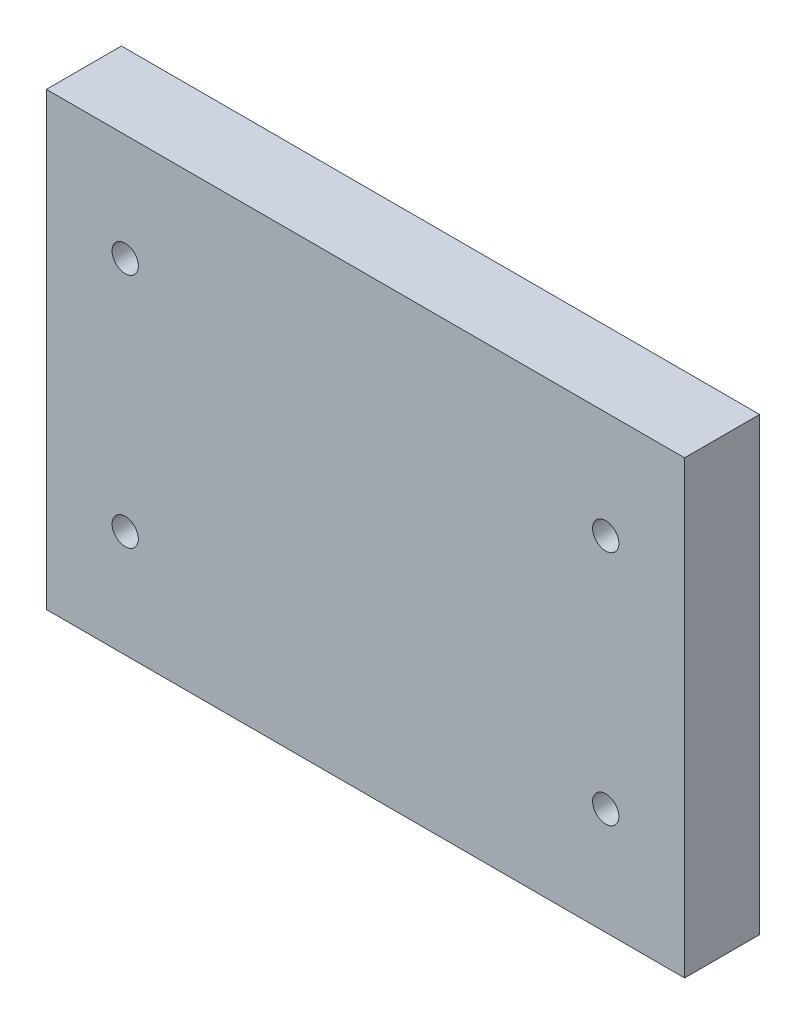
ISO-10303-21;
HEADER;
FILE_DESCRIPTION(('STEP AP214'),'2;1');
FILE_NAME('part.step','',(''),(''),'','','');
FILE_SCHEMA(('AUTOMOTIVE_DESIGN { 1 0 10303 214 1 1 1 1 }'));
ENDSEC;
DATA;
#1=APPLICATION_CONTEXT('core data for automotive mechanical design processes');
#2=APPLICATION_PROTOCOL_DEFINITION('international standard','automotive_design',2000,#1);
#3=PRODUCT_CONTEXT('',#1,'mechanical');
#4=PRODUCT('Part','Part','',(#3));
#5=PRODUCT_RELATED_PRODUCT_CATEGORY('part','',(#4));
#6=PRODUCT_DEFINITION_FORMATION('','',#4);
#7=PRODUCT_DEFINITION_CONTEXT('part definition',#1,'design');
#8=PRODUCT_DEFINITION('design','',#6,#7);
#9=PRODUCT_DEFINITION_SHAPE('','',#8);
#10=(LENGTH_UNIT() NAMED_UNIT(*) SI_UNIT(.MILLI.,.METRE.));
#11=(NAMED_UNIT(*) PLANE_ANGLE_UNIT() SI_UNIT($,.RADIAN.));
#12=(NAMED_UNIT(*) SI_UNIT($,.STERADIAN.) SOLID_ANGLE_UNIT());
#13=UNCERTAINTY_MEASURE_WITH_UNIT(LENGTH_MEASURE(1.E-05),#10,'distance_accuracy_value','');
#14=(GEOMETRIC_REPRESENTATION_CONTEXT(3) GLOBAL_UNCERTAINTY_ASSIGNED_CONTEXT((#13)) GLOBAL_UNIT_ASSIGNED_CONTEXT((#10,
#11,#12)) REPRESENTATION_CONTEXT('',''));
#15=CARTESIAN_POINT('',(0.,0.,0.));
#16=DIRECTION('',(0.,0.,1.));
#17=DIRECTION('',(1.,0.,0.));
#18=AXIS2_PLACEMENT_3D('',#15,#16,#17);
#19=CARTESIAN_POINT('',(42.5,30.,10.));
#20=DIRECTION('',(-1.,0.,0.));
#21=DIRECTION('',(0.,0.,1.));
#22=AXIS2_PLACEMENT_3D('',#19,#20,#21);
#23=PLANE('',#22);
#24=DIRECTION('',(0.,1.,0.));
#25=VECTOR('',#24,1.);
#26=CARTESIAN_POINT('',(42.5,30.,0.));
#27=LINE('',#26,#25);
#28=CARTESIAN_POINT('',(42.5,-30.,0.));
#29=VERTEX_POINT('',#28);
#30=CARTESIAN_POINT('',(42.5,30.,0.));
#31=VERTEX_POINT('',#30);
#32=EDGE_CURVE('E106',#29,#31,#27,.T.);
#33=ORIENTED_EDGE('',*,*,#32,.T.);
#34=DIRECTION('',(0.,0.,-1.));
#35=VECTOR('',#34,1.);
#36=CARTESIAN_POINT('',(42.5,30.,10.));
#37=LINE('',#36,#35);
#38=CARTESIAN_POINT('',(42.5,30.,10.));
#39=VERTEX_POINT('',#38);
#40=EDGE_CURVE('E11',#39,#31,#37,.T.);
#41=ORIENTED_EDGE('',*,*,#40,.F.);
#42=DIRECTION('',(0.,1.,0.));
#43=VECTOR('',#42,1.);
#44=CARTESIAN_POINT('',(42.5,30.,10.));
#45=LINE('',#44,#43);
#46=CARTESIAN_POINT('',(42.5,-30.,10.));
#47=VERTEX_POINT('',#46);
#48=EDGE_CURVE('E94',#47,#39,#45,.T.);
#49=ORIENTED_EDGE('',*,*,#48,.F.);
#50=DIRECTION('',(0.,0.,-1.));
#51=VECTOR('',#50,1.);
#52=CARTESIAN_POINT('',(42.5,-30.,10.));
#53=LINE('',#52,#51);
#54=EDGE_CURVE('E102',#47,#29,#53,.T.);
#55=ORIENTED_EDGE('',*,*,#54,.T.);
#56=EDGE_LOOP('',(#33,#41,#49,#55));
#57=FACE_BOUND('',#56,.T.);
#58=ADVANCED_FACE('F43',(#57),#23,.F.);
#59=CARTESIAN_POINT('',(-42.5,30.,10.));
#60=DIRECTION('',(0.,-1.,0.));
#61=DIRECTION('',(0.,0.,-1.));
#62=AXIS2_PLACEMENT_3D('',#59,#60,#61);
#63=PLANE('',#62);
#64=DIRECTION('',(-1.,0.,0.));
#65=VECTOR('',#64,1.);
#66=CARTESIAN_POINT('',(-42.5,30.,0.));
#67=LINE('',#66,#65);
#68=CARTESIAN_POINT('',(-42.5,30.,0.));
#69=VERTEX_POINT('',#68);
#70=EDGE_CURVE('E98',#31,#69,#67,.T.);
#71=ORIENTED_EDGE('',*,*,#70,.T.);
#72=DIRECTION('',(0.,0.,-1.));
#73=VECTOR('',#72,1.);
#74=CARTESIAN_POINT('',(-42.5,30.,10.));
#75=LINE('',#74,#73);
#76=CARTESIAN_POINT('',(-42.5,30.,10.));
#77=VERTEX_POINT('',#76);
#78=EDGE_CURVE('E51',#77,#69,#75,.T.);
#79=ORIENTED_EDGE('',*,*,#78,.F.);
#80=DIRECTION('',(-1.,0.,0.));
#81=VECTOR('',#80,1.);
#82=CARTESIAN_POINT('',(-42.5,30.,10.));
#83=LINE('',#82,#81);
#84=EDGE_CURVE('E89',#39,#77,#83,.T.);
#85=ORIENTED_EDGE('',*,*,#84,.F.);
#86=ORIENTED_EDGE('',*,*,#40,.T.);
#87=EDGE_LOOP('',(#71,#79,#85,#86));
#88=FACE_BOUND('',#87,.T.);
#89=ADVANCED_FACE('F97',(#88),#63,.F.);
#90=CARTESIAN_POINT('',(-42.5,30.,10.));
#91=DIRECTION('',(1.,0.,0.));
#92=DIRECTION('',(0.,0.,-1.));
#93=AXIS2_PLACEMENT_3D('',#90,#91,#92);
#94=PLANE('',#93);
#95=DIRECTION('',(0.,-1.,0.));
#96=VECTOR('',#95,1.);
#97=CARTESIAN_POINT('',(-42.5,30.,0.));
#98=LINE('',#97,#96);
#99=CARTESIAN_POINT('',(-42.5,-30.,0.));
#100=VERTEX_POINT('',#99);
#101=EDGE_CURVE('E76',#69,#100,#98,.T.);
#102=ORIENTED_EDGE('',*,*,#101,.T.);
#103=DIRECTION('',(0.,0.,-1.));
#104=VECTOR('',#103,1.);
#105=CARTESIAN_POINT('',(-42.5,-30.,10.));
#106=LINE('',#105,#104);
#107=CARTESIAN_POINT('',(-42.5,-30.,10.));
#108=VERTEX_POINT('',#107);
#109=EDGE_CURVE('E99',#108,#100,#106,.T.);
#110=ORIENTED_EDGE('',*,*,#109,.F.);
#111=DIRECTION('',(0.,-1.,0.));
#112=VECTOR('',#111,1.);
#113=CARTESIAN_POINT('',(-42.5,30.,10.));
#114=LINE('',#113,#112);
#115=EDGE_CURVE('E92',#77,#108,#114,.T.);
#116=ORIENTED_EDGE('',*,*,#115,.F.);
#117=ORIENTED_EDGE('',*,*,#78,.T.);
#118=EDGE_LOOP('',(#102,#110,#116,#117));
#119=FACE_BOUND('',#118,.T.);
#120=ADVANCED_FACE('F100',(#119),#94,.F.);
#121=CARTESIAN_POINT('',(-42.5,-30.,10.));
#122=DIRECTION('',(0.,1.,0.));
#123=DIRECTION('',(0.,0.,1.));
#124=AXIS2_PLACEMENT_3D('',#121,#122,#123);
#125=PLANE('',#124);
#126=DIRECTION('',(1.,0.,0.));
#127=VECTOR('',#126,1.);
#128=CARTESIAN_POINT('',(-42.5,-30.,0.));
#129=LINE('',#128,#127);
#130=EDGE_CURVE('E82',#100,#29,#129,.T.);
#131=ORIENTED_EDGE('',*,*,#130,.T.);
#132=ORIENTED_EDGE('',*,*,#54,.F.);
#133=DIRECTION('',(1.,0.,0.));
#134=VECTOR('',#133,1.);
#135=CARTESIAN_POINT('',(-42.5,-30.,10.));
#136=LINE('',#135,#134);
#137=EDGE_CURVE('E59',#108,#47,#136,.T.);
#138=ORIENTED_EDGE('',*,*,#137,.F.);
#139=ORIENTED_EDGE('',*,*,#109,.T.);
#140=EDGE_LOOP('',(#131,#132,#138,#139));
#141=FACE_BOUND('',#140,.T.);
#142=ADVANCED_FACE('F114',(#141),#125,.F.);
#143=CARTESIAN_POINT('',(0.,0.,10.));
#144=DIRECTION('',(0.,0.,1.));
#145=DIRECTION('',(1.,0.,0.));
#146=AXIS2_PLACEMENT_3D('',#143,#144,#145);
#147=PLANE('',#146);
#148=CARTESIAN_POINT('',(-32.,-15.75,10.));
#149=DIRECTION('',(0.,0.,1.));
#150=DIRECTION('',(1.,0.,0.));
#151=AXIS2_PLACEMENT_3D('',#148,#149,#150);
#152=CIRCLE('',#151,1.75);
#153=CARTESIAN_POINT('',(-30.25,-15.75,10.));
#154=VERTEX_POINT('',#153);
#155=EDGE_CURVE('E123',#154,#154,#152,.T.);
#156=ORIENTED_EDGE('',*,*,#155,.F.);
#157=EDGE_LOOP('',(#156));
#158=FACE_BOUND('',#157,.T.);
#159=CARTESIAN_POINT('',(32.,15.75,10.));
#160=DIRECTION('',(0.,0.,1.));
#161=DIRECTION('',(1.,0.,0.));
#162=AXIS2_PLACEMENT_3D('',#159,#160,#161);
#163=CIRCLE('',#162,1.75);
#164=CARTESIAN_POINT('',(33.75,15.75,10.));
#165=VERTEX_POINT('',#164);
#166=EDGE_CURVE('E129',#165,#165,#163,.T.);
#167=ORIENTED_EDGE('',*,*,#166,.F.);
#168=EDGE_LOOP('',(#167));
#169=FACE_BOUND('',#168,.T.);
#170=CARTESIAN_POINT('',(32.,-15.75,10.));
#171=DIRECTION('',(0.,0.,1.));
#172=DIRECTION('',(1.,0.,0.));
#173=AXIS2_PLACEMENT_3D('',#170,#171,#172);
#174=CIRCLE('',#173,1.75);
#175=CARTESIAN_POINT('',(33.75,-15.75,10.));
#176=VERTEX_POINT('',#175);
#177=EDGE_CURVE('E130',#176,#176,#174,.T.);
#178=ORIENTED_EDGE('',*,*,#177,.F.);
#179=EDGE_LOOP('',(#178));
#180=FACE_BOUND('',#179,.T.);
#181=CARTESIAN_POINT('',(-32.,15.75,10.));
#182=DIRECTION('',(0.,0.,1.));
#183=DIRECTION('',(1.,0.,0.));
#184=AXIS2_PLACEMENT_3D('',#181,#182,#183);
#185=CIRCLE('',#184,1.75);
#186=CARTESIAN_POINT('',(-30.25,15.75,10.));
#187=VERTEX_POINT('',#186);
#188=EDGE_CURVE('E120',#187,#187,#185,.T.);
#189=ORIENTED_EDGE('',*,*,#188,.F.);
#190=EDGE_LOOP('',(#189));
#191=FACE_BOUND('',#190,.T.);
#192=ORIENTED_EDGE('',*,*,#48,.T.);
#193=ORIENTED_EDGE('',*,*,#84,.T.);
#194=ORIENTED_EDGE('',*,*,#115,.T.);
#195=ORIENTED_EDGE('',*,*,#137,.T.);
#196=EDGE_LOOP('',(#192,#193,#194,#195));
#197=FACE_BOUND('',#196,.T.);
#198=ADVANCED_FACE('F90',(#158,#169,#180,#191,#197),#147,.T.);
#199=CARTESIAN_POINT('',(0.,0.,0.));
#200=DIRECTION('',(0.,0.,1.));
#201=DIRECTION('',(1.,0.,0.));
#202=AXIS2_PLACEMENT_3D('',#199,#200,#201);
#203=PLANE('',#202);
#204=CARTESIAN_POINT('',(-32.,-15.75,0.));
#205=DIRECTION('',(0.,0.,1.));
#206=DIRECTION('',(1.,0.,0.));
#207=AXIS2_PLACEMENT_3D('',#204,#205,#206);
#208=CIRCLE('',#207,1.75);
#209=CARTESIAN_POINT('',(-30.25,-15.75,0.));
#210=VERTEX_POINT('',#209);
#211=EDGE_CURVE('E133',#210,#210,#208,.T.);
#212=ORIENTED_EDGE('',*,*,#211,.T.);
#213=EDGE_LOOP('',(#212));
#214=FACE_BOUND('',#213,.T.);
#215=CARTESIAN_POINT('',(32.,15.75,0.));
#216=DIRECTION('',(0.,0.,1.));
#217=DIRECTION('',(1.,0.,0.));
#218=AXIS2_PLACEMENT_3D('',#215,#216,#217);
#219=CIRCLE('',#218,1.75);
#220=CARTESIAN_POINT('',(33.75,15.75,0.));
#221=VERTEX_POINT('',#220);
#222=EDGE_CURVE('E126',#221,#221,#219,.T.);
#223=ORIENTED_EDGE('',*,*,#222,.T.);
#224=EDGE_LOOP('',(#223));
#225=FACE_BOUND('',#224,.T.);
#226=CARTESIAN_POINT('',(32.,-15.75,0.));
#227=DIRECTION('',(0.,0.,1.));
#228=DIRECTION('',(1.,0.,0.));
#229=AXIS2_PLACEMENT_3D('',#226,#227,#228);
#230=CIRCLE('',#229,1.75);
#231=CARTESIAN_POINT('',(33.75,-15.75,0.));
#232=VERTEX_POINT('',#231);
#233=EDGE_CURVE('E138',#232,#232,#230,.T.);
#234=ORIENTED_EDGE('',*,*,#233,.T.);
#235=EDGE_LOOP('',(#234));
#236=FACE_BOUND('',#235,.T.);
#237=CARTESIAN_POINT('',(-32.,15.75,0.));
#238=DIRECTION('',(0.,0.,1.));
#239=DIRECTION('',(1.,0.,0.));
#240=AXIS2_PLACEMENT_3D('',#237,#238,#239);
#241=CIRCLE('',#240,1.75);
#242=CARTESIAN_POINT('',(-30.25,15.75,0.));
#243=VERTEX_POINT('',#242);
#244=EDGE_CURVE('E109',#243,#243,#241,.T.);
#245=ORIENTED_EDGE('',*,*,#244,.T.);
#246=EDGE_LOOP('',(#245));
#247=FACE_BOUND('',#246,.T.);
#248=ORIENTED_EDGE('',*,*,#32,.F.);
#249=ORIENTED_EDGE('',*,*,#130,.F.);
#250=ORIENTED_EDGE('',*,*,#101,.F.);
#251=ORIENTED_EDGE('',*,*,#70,.F.);
#252=EDGE_LOOP('',(#248,#249,#250,#251));
#253=FACE_BOUND('',#252,.T.);
#254=ADVANCED_FACE('F117',(#214,#225,#236,#247,#253),#203,.F.);
#255=CARTESIAN_POINT('',(-32.,15.75,0.));
#256=DIRECTION('',(0.,0.,1.));
#257=DIRECTION('',(1.,0.,0.));
#258=AXIS2_PLACEMENT_3D('',#255,#256,#257);
#259=CYLINDRICAL_SURFACE('',#258,1.75);
#260=ORIENTED_EDGE('',*,*,#244,.F.);
#261=EDGE_LOOP('',(#260));
#262=FACE_BOUND('',#261,.T.);
#263=ORIENTED_EDGE('',*,*,#188,.T.);
#264=EDGE_LOOP('',(#263));
#265=FACE_BOUND('',#264,.T.);
#266=ADVANCED_FACE('F152',(#262,#265),#259,.F.);
#267=CARTESIAN_POINT('',(32.,-15.75,0.));
#268=DIRECTION('',(0.,0.,1.));
#269=DIRECTION('',(1.,0.,0.));
#270=AXIS2_PLACEMENT_3D('',#267,#268,#269);
#271=CYLINDRICAL_SURFACE('',#270,1.75);
#272=ORIENTED_EDGE('',*,*,#233,.F.);
#273=EDGE_LOOP('',(#272));
#274=FACE_BOUND('',#273,.T.);
#275=ORIENTED_EDGE('',*,*,#177,.T.);
#276=EDGE_LOOP('',(#275));
#277=FACE_BOUND('',#276,.T.);
#278=ADVANCED_FACE('F144',(#274,#277),#271,.F.);
#279=CARTESIAN_POINT('',(32.,15.75,0.));
#280=DIRECTION('',(0.,0.,1.));
#281=DIRECTION('',(1.,0.,0.));
#282=AXIS2_PLACEMENT_3D('',#279,#280,#281);
#283=CYLINDRICAL_SURFACE('',#282,1.75);
#284=ORIENTED_EDGE('',*,*,#222,.F.);
#285=EDGE_LOOP('',(#284));
#286=FACE_BOUND('',#285,.T.);
#287=ORIENTED_EDGE('',*,*,#166,.T.);
#288=EDGE_LOOP('',(#287));
#289=FACE_BOUND('',#288,.T.);
#290=ADVANCED_FACE('F160',(#286,#289),#283,.F.);
#291=CARTESIAN_POINT('',(-32.,-15.75,0.));
#292=DIRECTION('',(0.,0.,1.));
#293=DIRECTION('',(1.,0.,0.));
#294=AXIS2_PLACEMENT_3D('',#291,#292,#293);
#295=CYLINDRICAL_SURFACE('',#294,1.75);
#296=ORIENTED_EDGE('',*,*,#211,.F.);
#297=EDGE_LOOP('',(#296));
#298=FACE_BOUND('',#297,.T.);
#299=ORIENTED_EDGE('',*,*,#155,.T.);
#300=EDGE_LOOP('',(#299));
#301=FACE_BOUND('',#300,.T.);
#302=ADVANCED_FACE('F211',(#298,#301),#295,.F.);
#303=CLOSED_SHELL('',(#58,#89,#120,#142,#198,#254,#266,#278,#290,#302));
#304=MANIFOLD_SOLID_BREP('B2',#303);
#305=ADVANCED_BREP_SHAPE_REPRESENTATION('',(#18,#304),#14);
#306=SHAPE_DEFINITION_REPRESENTATION(#9,#305);
ENDSEC;
END-ISO-10303-21;
